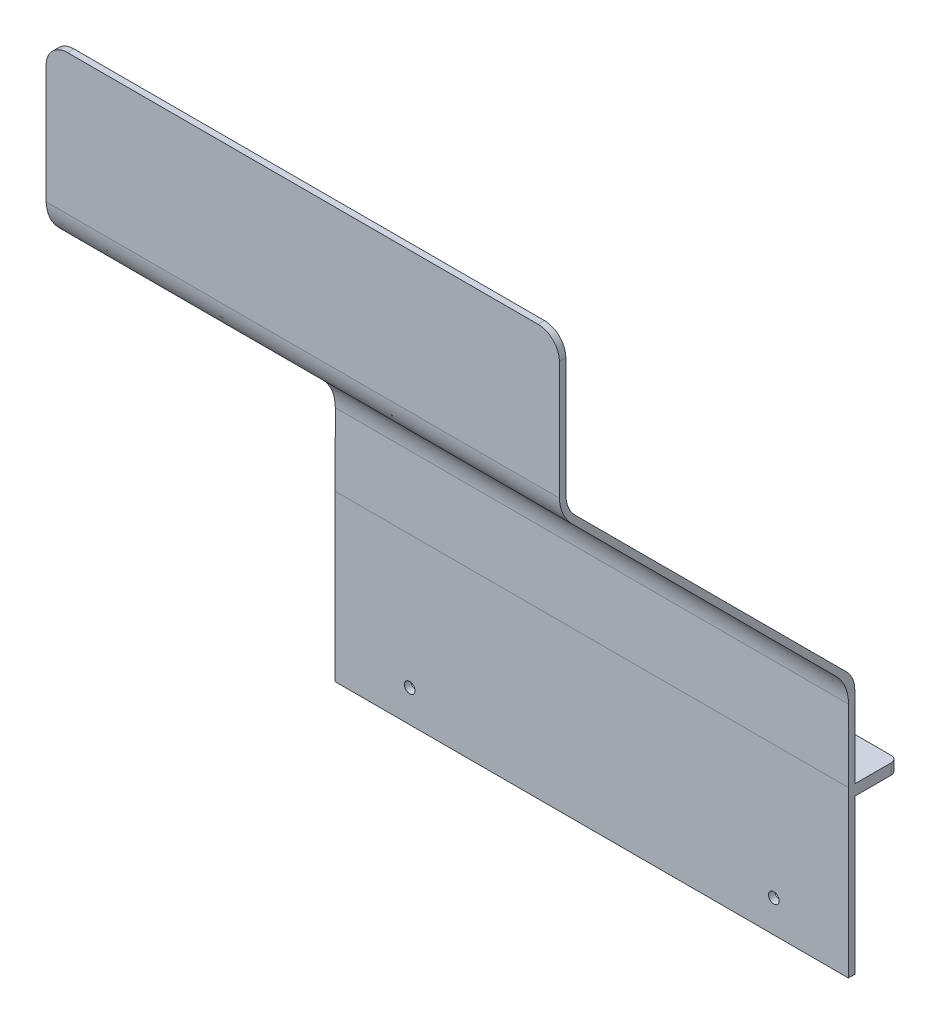
ISO-10303-21;
HEADER;
FILE_DESCRIPTION(('STEP AP214'),'2;1');
FILE_NAME('part.step','',(''),(''),'','','');
FILE_SCHEMA(('AUTOMOTIVE_DESIGN { 1 0 10303 214 1 1 1 1 }'));
ENDSEC;
DATA;
#1=APPLICATION_CONTEXT('core data for automotive mechanical design processes');
#2=APPLICATION_PROTOCOL_DEFINITION('international standard','automotive_design',2000,#1);
#3=PRODUCT_CONTEXT('',#1,'mechanical');
#4=PRODUCT('Part','Part','',(#3));
#5=PRODUCT_RELATED_PRODUCT_CATEGORY('part','',(#4));
#6=PRODUCT_DEFINITION_FORMATION('','',#4);
#7=PRODUCT_DEFINITION_CONTEXT('part definition',#1,'design');
#8=PRODUCT_DEFINITION('design','',#6,#7);
#9=PRODUCT_DEFINITION_SHAPE('','',#8);
#10=(LENGTH_UNIT() NAMED_UNIT(*) SI_UNIT(.MILLI.,.METRE.));
#11=(NAMED_UNIT(*) PLANE_ANGLE_UNIT() SI_UNIT($,.RADIAN.));
#12=(NAMED_UNIT(*) SI_UNIT($,.STERADIAN.) SOLID_ANGLE_UNIT());
#13=UNCERTAINTY_MEASURE_WITH_UNIT(LENGTH_MEASURE(1.E-05),#10,'distance_accuracy_value','');
#14=(GEOMETRIC_REPRESENTATION_CONTEXT(3) GLOBAL_UNCERTAINTY_ASSIGNED_CONTEXT((#13)) GLOBAL_UNIT_ASSIGNED_CONTEXT((#10,
#11,#12)) REPRESENTATION_CONTEXT('',''));
#15=CARTESIAN_POINT('',(0.,0.,0.));
#16=DIRECTION('',(0.,0.,1.));
#17=DIRECTION('',(1.,0.,0.));
#18=AXIS2_PLACEMENT_3D('',#15,#16,#17);
#19=CARTESIAN_POINT('',(0.,41.,0.));
#20=DIRECTION('',(0.,-1.,0.));
#21=DIRECTION('',(1.,0.,0.));
#22=AXIS2_PLACEMENT_3D('',#19,#20,#21);
#23=PLANE('',#22);
#24=CARTESIAN_POINT('',(65.,41.,-8.5));
#25=DIRECTION('',(0.,1.,0.));
#26=DIRECTION('',(1.,0.,0.));
#27=AXIS2_PLACEMENT_3D('',#24,#25,#26);
#28=CIRCLE('',#27,2.50000000000002);
#29=CARTESIAN_POINT('',(67.5,41.,-8.5));
#30=VERTEX_POINT('',#29);
#31=EDGE_CURVE('E361',#30,#30,#28,.T.);
#32=ORIENTED_EDGE('',*,*,#31,.F.);
#33=EDGE_LOOP('',(#32));
#34=FACE_BOUND('',#33,.T.);
#35=CARTESIAN_POINT('',(-65.,41.,-8.5));
#36=DIRECTION('',(0.,1.,0.));
#37=DIRECTION('',(-1.,0.,0.));
#38=AXIS2_PLACEMENT_3D('',#35,#36,#37);
#39=CIRCLE('',#38,2.50000000000002);
#40=CARTESIAN_POINT('',(-67.5,41.,-8.5));
#41=VERTEX_POINT('',#40);
#42=EDGE_CURVE('E421',#41,#41,#39,.T.);
#43=ORIENTED_EDGE('',*,*,#42,.F.);
#44=EDGE_LOOP('',(#43));
#45=FACE_BOUND('',#44,.T.);
#46=DIRECTION('',(-1.,0.,0.));
#47=VECTOR('',#46,1.);
#48=CARTESIAN_POINT('',(119.8,41.,0.));
#49=LINE('',#48,#47);
#50=CARTESIAN_POINT('',(119.8,41.,0.));
#51=VERTEX_POINT('',#50);
#52=CARTESIAN_POINT('',(-119.8,40.9999999999999,0.));
#53=VERTEX_POINT('',#52);
#54=EDGE_CURVE('E444',#51,#53,#49,.T.);
#55=ORIENTED_EDGE('',*,*,#54,.F.);
#56=DIRECTION('',(0.,0.,-1.));
#57=VECTOR('',#56,1.);
#58=CARTESIAN_POINT('',(119.8,41.,3.));
#59=LINE('',#58,#57);
#60=CARTESIAN_POINT('',(119.8,41.,-17.));
#61=VERTEX_POINT('',#60);
#62=EDGE_CURVE('E410',#51,#61,#59,.T.);
#63=ORIENTED_EDGE('',*,*,#62,.T.);
#64=CARTESIAN_POINT('',(116.8,41.,-17.));
#65=DIRECTION('',(0.,-1.,0.));
#66=DIRECTION('',(1.,0.,0.));
#67=AXIS2_PLACEMENT_3D('',#64,#65,#66);
#68=CIRCLE('',#67,3.);
#69=CARTESIAN_POINT('',(116.8,41.,-20.));
#70=VERTEX_POINT('',#69);
#71=EDGE_CURVE('E368',#61,#70,#68,.F.);
#72=ORIENTED_EDGE('',*,*,#71,.T.);
#73=DIRECTION('',(-1.,0.,0.));
#74=VECTOR('',#73,1.);
#75=CARTESIAN_POINT('',(-119.8,40.9999999999999,-20.));
#76=LINE('',#75,#74);
#77=CARTESIAN_POINT('',(-116.8,40.9999999999999,-20.));
#78=VERTEX_POINT('',#77);
#79=EDGE_CURVE('E398',#70,#78,#76,.T.);
#80=ORIENTED_EDGE('',*,*,#79,.T.);
#81=CARTESIAN_POINT('',(-116.8,40.9999999999999,-17.));
#82=DIRECTION('',(0.,-1.,0.));
#83=DIRECTION('',(1.,0.,0.));
#84=AXIS2_PLACEMENT_3D('',#81,#82,#83);
#85=CIRCLE('',#84,3.);
#86=CARTESIAN_POINT('',(-119.8,40.9999999999999,-17.));
#87=VERTEX_POINT('',#86);
#88=EDGE_CURVE('E370',#78,#87,#85,.F.);
#89=ORIENTED_EDGE('',*,*,#88,.T.);
#90=DIRECTION('',(0.,0.,1.));
#91=VECTOR('',#90,1.);
#92=CARTESIAN_POINT('',(-119.8,40.9999999999999,3.));
#93=LINE('',#92,#91);
#94=EDGE_CURVE('E402',#87,#53,#93,.T.);
#95=ORIENTED_EDGE('',*,*,#94,.T.);
#96=EDGE_LOOP('',(#55,#63,#72,#80,#89,#95));
#97=FACE_BOUND('',#96,.T.);
#98=ADVANCED_FACE('F34',(#34,#45,#97),#23,.F.);
#99=CARTESIAN_POINT('',(125.,-36.,3.));
#100=DIRECTION('',(0.,1.,0.));
#101=DIRECTION('',(-1.,0.,0.));
#102=AXIS2_PLACEMENT_3D('',#99,#100,#101);
#103=PLANE('',#102);
#104=DIRECTION('',(1.,0.,0.));
#105=VECTOR('',#104,1.);
#106=CARTESIAN_POINT('',(125.,-36.,3.));
#107=LINE('',#106,#105);
#108=CARTESIAN_POINT('',(-119.8,-36.,3.));
#109=VERTEX_POINT('',#108);
#110=CARTESIAN_POINT('',(119.8,-36.,3.));
#111=VERTEX_POINT('',#110);
#112=EDGE_CURVE('E385',#109,#111,#107,.T.);
#113=ORIENTED_EDGE('',*,*,#112,.F.);
#114=DIRECTION('',(0.,0.,1.));
#115=VECTOR('',#114,1.);
#116=CARTESIAN_POINT('',(-119.8,-36.,-1.99999999999999));
#117=LINE('',#116,#115);
#118=CARTESIAN_POINT('',(-119.8,-36.,0.));
#119=VERTEX_POINT('',#118);
#120=EDGE_CURVE('E437',#119,#109,#117,.T.);
#121=ORIENTED_EDGE('',*,*,#120,.F.);
#122=DIRECTION('',(1.,0.,0.));
#123=VECTOR('',#122,1.);
#124=CARTESIAN_POINT('',(125.,-36.,0.));
#125=LINE('',#124,#123);
#126=CARTESIAN_POINT('',(119.8,-36.,0.));
#127=VERTEX_POINT('',#126);
#128=EDGE_CURVE('E389',#119,#127,#125,.T.);
#129=ORIENTED_EDGE('',*,*,#128,.T.);
#130=DIRECTION('',(0.,0.,1.));
#131=VECTOR('',#130,1.);
#132=CARTESIAN_POINT('',(119.8,-36.,-1.99999999999999));
#133=LINE('',#132,#131);
#134=EDGE_CURVE('E438',#127,#111,#133,.T.);
#135=ORIENTED_EDGE('',*,*,#134,.T.);
#136=EDGE_LOOP('',(#113,#121,#129,#135));
#137=FACE_BOUND('',#136,.T.);
#138=ADVANCED_FACE('F275',(#137),#103,.F.);
#139=CARTESIAN_POINT('',(0.,0.,3.));
#140=DIRECTION('',(0.,0.,1.));
#141=DIRECTION('',(1.,0.,0.));
#142=AXIS2_PLACEMENT_3D('',#139,#140,#141);
#143=PLANE('',#142);
#144=DIRECTION('',(0.,-1.,0.));
#145=VECTOR('',#144,1.);
#146=CARTESIAN_POINT('',(-119.8,40.9999999999999,3.));
#147=LINE('',#146,#145);
#148=CARTESIAN_POINT('',(-119.8,40.9999999999999,3.));
#149=VERTEX_POINT('',#148);
#150=EDGE_CURVE('E392',#149,#109,#147,.T.);
#151=ORIENTED_EDGE('',*,*,#150,.T.);
#152=ORIENTED_EDGE('',*,*,#112,.T.);
#153=DIRECTION('',(0.,-1.,0.));
#154=VECTOR('',#153,1.);
#155=CARTESIAN_POINT('',(119.8,41.,3.));
#156=LINE('',#155,#154);
#157=CARTESIAN_POINT('',(119.8,41.,3.));
#158=VERTEX_POINT('',#157);
#159=EDGE_CURVE('E396',#158,#111,#156,.T.);
#160=ORIENTED_EDGE('',*,*,#159,.F.);
#161=DIRECTION('',(1.,0.,0.));
#162=VECTOR('',#161,1.);
#163=CARTESIAN_POINT('',(-119.8,40.9999999999999,3.));
#164=LINE('',#163,#162);
#165=EDGE_CURVE('E412',#149,#158,#164,.T.);
#166=ORIENTED_EDGE('',*,*,#165,.F.);
#167=EDGE_LOOP('',(#151,#152,#160,#166));
#168=FACE_BOUND('',#167,.T.);
#169=CARTESIAN_POINT('',(-84.9999999999998,-21.,3.));
#170=DIRECTION('',(0.,0.,1.));
#171=DIRECTION('',(1.,0.,0.));
#172=AXIS2_PLACEMENT_3D('',#169,#170,#171);
#173=CIRCLE('',#172,2.50000000000001);
#174=CARTESIAN_POINT('',(-82.4999999999998,-21.,3.));
#175=VERTEX_POINT('',#174);
#176=EDGE_CURVE('E365',#175,#175,#173,.T.);
#177=ORIENTED_EDGE('',*,*,#176,.F.);
#178=EDGE_LOOP('',(#177));
#179=FACE_BOUND('',#178,.T.);
#180=CARTESIAN_POINT('',(84.9999999999998,-21.,3.));
#181=DIRECTION('',(0.,0.,1.));
#182=DIRECTION('',(-1.,0.,0.));
#183=AXIS2_PLACEMENT_3D('',#180,#181,#182);
#184=CIRCLE('',#183,2.50000000000001);
#185=CARTESIAN_POINT('',(82.4999999999998,-21.,3.));
#186=VERTEX_POINT('',#185);
#187=EDGE_CURVE('E426',#186,#186,#184,.T.);
#188=ORIENTED_EDGE('',*,*,#187,.F.);
#189=EDGE_LOOP('',(#188));
#190=FACE_BOUND('',#189,.T.);
#191=ADVANCED_FACE('F290',(#168,#179,#190),#143,.T.);
#192=CARTESIAN_POINT('',(0.,0.,0.));
#193=DIRECTION('',(0.,0.,1.));
#194=DIRECTION('',(1.,0.,0.));
#195=AXIS2_PLACEMENT_3D('',#192,#193,#194);
#196=PLANE('',#195);
#197=CARTESIAN_POINT('',(-84.9999999999998,-21.,0.));
#198=DIRECTION('',(0.,0.,1.));
#199=DIRECTION('',(1.,0.,0.));
#200=AXIS2_PLACEMENT_3D('',#197,#198,#199);
#201=CIRCLE('',#200,2.50000000000001);
#202=CARTESIAN_POINT('',(-82.4999999999998,-21.,0.));
#203=VERTEX_POINT('',#202);
#204=EDGE_CURVE('E358',#203,#203,#201,.T.);
#205=ORIENTED_EDGE('',*,*,#204,.T.);
#206=EDGE_LOOP('',(#205));
#207=FACE_BOUND('',#206,.T.);
#208=CARTESIAN_POINT('',(84.9999999999998,-21.,0.));
#209=DIRECTION('',(0.,0.,1.));
#210=DIRECTION('',(1.,0.,0.));
#211=AXIS2_PLACEMENT_3D('',#208,#209,#210);
#212=CIRCLE('',#211,2.50000000000001);
#213=CARTESIAN_POINT('',(87.4999999999998,-21.,0.));
#214=VERTEX_POINT('',#213);
#215=EDGE_CURVE('E362',#214,#214,#212,.T.);
#216=ORIENTED_EDGE('',*,*,#215,.T.);
#217=EDGE_LOOP('',(#216));
#218=FACE_BOUND('',#217,.T.);
#219=ORIENTED_EDGE('',*,*,#128,.F.);
#220=DIRECTION('',(0.,1.,0.));
#221=VECTOR('',#220,1.);
#222=CARTESIAN_POINT('',(-119.8,0.,0.));
#223=LINE('',#222,#221);
#224=CARTESIAN_POINT('',(-119.8,36.,0.));
#225=VERTEX_POINT('',#224);
#226=EDGE_CURVE('E429',#119,#225,#223,.T.);
#227=ORIENTED_EDGE('',*,*,#226,.T.);
#228=DIRECTION('',(-1.,0.,0.));
#229=VECTOR('',#228,1.);
#230=CARTESIAN_POINT('',(125.,36.,0.));
#231=LINE('',#230,#229);
#232=CARTESIAN_POINT('',(119.8,36.,0.));
#233=VERTEX_POINT('',#232);
#234=EDGE_CURVE('E386',#233,#225,#231,.T.);
#235=ORIENTED_EDGE('',*,*,#234,.F.);
#236=DIRECTION('',(0.,-1.,0.));
#237=VECTOR('',#236,1.);
#238=CARTESIAN_POINT('',(119.8,0.,0.));
#239=LINE('',#238,#237);
#240=EDGE_CURVE('E434',#233,#127,#239,.T.);
#241=ORIENTED_EDGE('',*,*,#240,.T.);
#242=EDGE_LOOP('',(#219,#227,#235,#241));
#243=FACE_BOUND('',#242,.T.);
#244=ADVANCED_FACE('F289',(#207,#218,#243),#196,.F.);
#245=CARTESIAN_POINT('',(-119.8,40.9999999999999,3.));
#246=DIRECTION('',(1.,0.,0.));
#247=DIRECTION('',(0.,1.,0.));
#248=AXIS2_PLACEMENT_3D('',#245,#246,#247);
#249=PLANE('',#248);
#250=DIRECTION('',(0.,1.,0.));
#251=VECTOR('',#250,1.);
#252=CARTESIAN_POINT('',(-119.8,0.,137.916490723047));
#253=LINE('',#252,#251);
#254=CARTESIAN_POINT('',(-119.8,225.455844122715,137.916490723047));
#255=VERTEX_POINT('',#254);
#256=CARTESIAN_POINT('',(-119.8,280.774355099311,137.916490723047));
#257=VERTEX_POINT('',#256);
#258=EDGE_CURVE('E460',#255,#257,#253,.T.);
#259=ORIENTED_EDGE('',*,*,#258,.T.);
#260=DIRECTION('',(0.,0.,1.));
#261=VECTOR('',#260,1.);
#262=CARTESIAN_POINT('',(-119.8,280.774355099311,3.));
#263=LINE('',#262,#261);
#264=CARTESIAN_POINT('',(-119.8,280.774355099311,134.916490723047));
#265=VERTEX_POINT('',#264);
#266=EDGE_CURVE('E11',#257,#265,#263,.F.);
#267=ORIENTED_EDGE('',*,*,#266,.T.);
#268=DIRECTION('',(0.,-1.,0.));
#269=VECTOR('',#268,1.);
#270=CARTESIAN_POINT('',(-119.8,0.,134.916490723047));
#271=LINE('',#270,#269);
#272=CARTESIAN_POINT('',(-119.8,225.455844122715,134.916490723047));
#273=VERTEX_POINT('',#272);
#274=EDGE_CURVE('E210',#265,#273,#271,.T.);
#275=ORIENTED_EDGE('',*,*,#274,.T.);
#276=CARTESIAN_POINT('',(-119.8,225.455844122715,119.916490723047));
#277=DIRECTION('',(-1.,0.,0.));
#278=DIRECTION('',(0.,-1.,0.));
#279=AXIS2_PLACEMENT_3D('',#276,#277,#278);
#280=CIRCLE('',#279,15.);
#281=CARTESIAN_POINT('',(-119.8,214.849242404917,130.523092440845));
#282=VERTEX_POINT('',#281);
#283=EDGE_CURVE('E207',#282,#273,#280,.T.);
#284=ORIENTED_EDGE('',*,*,#283,.F.);
#285=DIRECTION('',(0.,-0.707106781186552,-0.707106781186543));
#286=VECTOR('',#285,1.);
#287=CARTESIAN_POINT('',(-119.8,42.1630749820351,-42.1630749820357));
#288=LINE('',#287,#286);
#289=CARTESIAN_POINT('',(-119.8,88.1297700251942,3.80362006112284));
#290=VERTEX_POINT('',#289);
#291=EDGE_CURVE('E338',#282,#290,#288,.T.);
#292=ORIENTED_EDGE('',*,*,#291,.T.);
#293=CARTESIAN_POINT('',(-119.8,78.9470188875171,12.9863711988001));
#294=DIRECTION('',(-1.,0.,0.));
#295=DIRECTION('',(0.,-1.,0.));
#296=AXIS2_PLACEMENT_3D('',#293,#294,#295);
#297=CIRCLE('',#296,12.9863711988001);
#298=CARTESIAN_POINT('',(-119.8,78.947018887517,0.));
#299=VERTEX_POINT('',#298);
#300=EDGE_CURVE('E197',#299,#290,#297,.F.);
#301=ORIENTED_EDGE('',*,*,#300,.F.);
#302=DIRECTION('',(0.,-1.,0.));
#303=VECTOR('',#302,1.);
#304=CARTESIAN_POINT('',(-119.8,0.,0.));
#305=LINE('',#304,#303);
#306=EDGE_CURVE('E484',#299,#53,#305,.T.);
#307=ORIENTED_EDGE('',*,*,#306,.T.);
#308=ORIENTED_EDGE('',*,*,#94,.F.);
#309=DIRECTION('',(0.,-1.,0.));
#310=VECTOR('',#309,1.);
#311=CARTESIAN_POINT('',(-119.8,40.9999999999999,-17.));
#312=LINE('',#311,#310);
#313=CARTESIAN_POINT('',(-119.8,36.,-17.));
#314=VERTEX_POINT('',#313);
#315=EDGE_CURVE('E357',#87,#314,#312,.T.);
#316=ORIENTED_EDGE('',*,*,#315,.T.);
#317=DIRECTION('',(0.,0.,1.));
#318=VECTOR('',#317,1.);
#319=CARTESIAN_POINT('',(-119.8,36.,3.));
#320=LINE('',#319,#318);
#321=EDGE_CURVE('E405',#314,#225,#320,.T.);
#322=ORIENTED_EDGE('',*,*,#321,.T.);
#323=ORIENTED_EDGE('',*,*,#226,.F.);
#324=ORIENTED_EDGE('',*,*,#120,.T.);
#325=ORIENTED_EDGE('',*,*,#150,.F.);
#326=DIRECTION('',(0.,0.999996932586317,-0.00247685646685071));
#327=VECTOR('',#326,1.);
#328=CARTESIAN_POINT('',(-119.8,0.00768207414414502,3.10153239918773));
#329=LINE('',#328,#327);
#330=CARTESIAN_POINT('',(-119.8,74.7157287525383,2.91649072304719));
#331=VERTEX_POINT('',#330);
#332=EDGE_CURVE('E478',#149,#331,#329,.T.);
#333=ORIENTED_EDGE('',*,*,#332,.T.);
#334=CARTESIAN_POINT('',(-119.8,74.7157287525383,2.91649072304719));
#335=CARTESIAN_POINT('',(-119.8,82.9519982352765,3.03237723446116));
#336=CARTESIAN_POINT('',(-119.8,88.8578643762694,8.77435509931623));
#337=B_SPLINE_CURVE_WITH_KNOTS('',2,(#334,#335,#336),.UNSPECIFIED.,.F.,.F.,(3,3),(0.,1.),.UNSPECIFIED.);
#338=CARTESIAN_POINT('',(-119.8,88.8578643762694,8.77435509931623));
#339=VERTEX_POINT('',#338);
#340=EDGE_CURVE('E473',#331,#339,#337,.T.);
#341=ORIENTED_EDGE('',*,*,#340,.T.);
#342=DIRECTION('',(0.,0.707106781186547,0.707106781186548));
#343=VECTOR('',#342,1.);
#344=CARTESIAN_POINT('',(-119.8,40.0417546384766,-40.0417546384766));
#345=LINE('',#344,#343);
#346=CARTESIAN_POINT('',(-119.8,212.142135623731,132.058626346778));
#347=VERTEX_POINT('',#346);
#348=EDGE_CURVE('E467',#339,#347,#345,.T.);
#349=ORIENTED_EDGE('',*,*,#348,.T.);
#350=CARTESIAN_POINT('',(-119.8,212.142135623731,132.058626346778));
#351=CARTESIAN_POINT('',(-119.8,217.729604737047,137.487179547832));
#352=CARTESIAN_POINT('',(-119.8,225.455844122715,137.916490723047));
#353=B_SPLINE_CURVE_WITH_KNOTS('',2,(#350,#351,#352),.UNSPECIFIED.,.F.,.F.,(3,3),(0.,1.),.UNSPECIFIED.);
#354=EDGE_CURVE('E462',#347,#255,#353,.T.);
#355=ORIENTED_EDGE('',*,*,#354,.T.);
#356=EDGE_LOOP('',(#259,#267,#275,#284,#292,#301,#307,#308,#316,#322,#323,#324,#325,#333,#341,
#349,#355));
#357=FACE_BOUND('',#356,.T.);
#358=ADVANCED_FACE('F286',(#357),#249,.F.);
#359=CARTESIAN_POINT('',(119.8,41.,3.));
#360=DIRECTION('',(-1.,0.,0.));
#361=DIRECTION('',(0.,-1.,0.));
#362=AXIS2_PLACEMENT_3D('',#359,#360,#361);
#363=PLANE('',#362);
#364=DIRECTION('',(0.,-1.,0.));
#365=VECTOR('',#364,1.);
#366=CARTESIAN_POINT('',(119.8,0.,134.916490723047));
#367=LINE('',#366,#365);
#368=CARTESIAN_POINT('',(119.8,280.774355099311,134.916490723047));
#369=VERTEX_POINT('',#368);
#370=CARTESIAN_POINT('',(119.8,225.455844122715,134.916490723047));
#371=VERTEX_POINT('',#370);
#372=EDGE_CURVE('E489',#369,#371,#367,.T.);
#373=ORIENTED_EDGE('',*,*,#372,.F.);
#374=DIRECTION('',(0.,0.,1.));
#375=VECTOR('',#374,1.);
#376=CARTESIAN_POINT('',(119.8,280.774355099311,3.));
#377=LINE('',#376,#375);
#378=CARTESIAN_POINT('',(119.8,280.774355099311,137.916490723047));
#379=VERTEX_POINT('',#378);
#380=EDGE_CURVE('E318',#369,#379,#377,.T.);
#381=ORIENTED_EDGE('',*,*,#380,.T.);
#382=DIRECTION('',(0.,1.,0.));
#383=VECTOR('',#382,1.);
#384=CARTESIAN_POINT('',(119.8,0.,137.916490723047));
#385=LINE('',#384,#383);
#386=CARTESIAN_POINT('',(119.8,225.455844122715,137.916490723047));
#387=VERTEX_POINT('',#386);
#388=EDGE_CURVE('E351',#387,#379,#385,.T.);
#389=ORIENTED_EDGE('',*,*,#388,.F.);
#390=CARTESIAN_POINT('',(119.8,212.142135623731,132.058626346778));
#391=CARTESIAN_POINT('',(119.8,217.729604737047,137.487179547832));
#392=CARTESIAN_POINT('',(119.8,225.455844122715,137.916490723047));
#393=B_SPLINE_CURVE_WITH_KNOTS('',2,(#390,#391,#392),.UNSPECIFIED.,.F.,.F.,(3,3),(0.,1.),.UNSPECIFIED.);
#394=CARTESIAN_POINT('',(119.8,212.142135623731,132.058626346778));
#395=VERTEX_POINT('',#394);
#396=EDGE_CURVE('E491',#395,#387,#393,.T.);
#397=ORIENTED_EDGE('',*,*,#396,.F.);
#398=DIRECTION('',(0.,0.707106781186547,0.707106781186548));
#399=VECTOR('',#398,1.);
#400=CARTESIAN_POINT('',(119.8,40.0417546384767,-40.0417546384766));
#401=LINE('',#400,#399);
#402=CARTESIAN_POINT('',(119.8,88.8578643762694,8.77435509931623));
#403=VERTEX_POINT('',#402);
#404=EDGE_CURVE('E226',#403,#395,#401,.T.);
#405=ORIENTED_EDGE('',*,*,#404,.F.);
#406=CARTESIAN_POINT('',(119.8,74.7157287525383,2.91649072304719));
#407=CARTESIAN_POINT('',(119.8,82.9519982352765,3.03237723446116));
#408=CARTESIAN_POINT('',(119.8,88.8578643762694,8.77435509931623));
#409=B_SPLINE_CURVE_WITH_KNOTS('',2,(#406,#407,#408),.UNSPECIFIED.,.F.,.F.,(3,3),(0.,1.),.UNSPECIFIED.);
#410=CARTESIAN_POINT('',(119.8,74.7157287525383,2.91649072304719));
#411=VERTEX_POINT('',#410);
#412=EDGE_CURVE('E220',#411,#403,#409,.T.);
#413=ORIENTED_EDGE('',*,*,#412,.F.);
#414=DIRECTION('',(0.,0.999996932586317,-0.00247685646685071));
#415=VECTOR('',#414,1.);
#416=CARTESIAN_POINT('',(119.8,0.00768207414419822,3.10153239918773));
#417=LINE('',#416,#415);
#418=EDGE_CURVE('E217',#158,#411,#417,.T.);
#419=ORIENTED_EDGE('',*,*,#418,.F.);
#420=ORIENTED_EDGE('',*,*,#159,.T.);
#421=ORIENTED_EDGE('',*,*,#134,.F.);
#422=ORIENTED_EDGE('',*,*,#240,.F.);
#423=DIRECTION('',(0.,0.,-1.));
#424=VECTOR('',#423,1.);
#425=CARTESIAN_POINT('',(119.8,36.,3.));
#426=LINE('',#425,#424);
#427=CARTESIAN_POINT('',(119.8,36.,-17.));
#428=VERTEX_POINT('',#427);
#429=EDGE_CURVE('E403',#233,#428,#426,.T.);
#430=ORIENTED_EDGE('',*,*,#429,.T.);
#431=DIRECTION('',(0.,-1.,0.));
#432=VECTOR('',#431,1.);
#433=CARTESIAN_POINT('',(119.8,41.,-17.));
#434=LINE('',#433,#432);
#435=EDGE_CURVE('E372',#428,#61,#434,.F.);
#436=ORIENTED_EDGE('',*,*,#435,.T.);
#437=ORIENTED_EDGE('',*,*,#62,.F.);
#438=DIRECTION('',(0.,-1.,0.));
#439=VECTOR('',#438,1.);
#440=CARTESIAN_POINT('',(119.8,0.,0.));
#441=LINE('',#440,#439);
#442=CARTESIAN_POINT('',(119.8,78.9470188875171,0.));
#443=VERTEX_POINT('',#442);
#444=EDGE_CURVE('E190',#443,#51,#441,.T.);
#445=ORIENTED_EDGE('',*,*,#444,.F.);
#446=CARTESIAN_POINT('',(119.8,78.9470188875171,12.9863711988001));
#447=DIRECTION('',(-1.,0.,0.));
#448=DIRECTION('',(0.,-1.,0.));
#449=AXIS2_PLACEMENT_3D('',#446,#447,#448);
#450=CIRCLE('',#449,12.9863711988001);
#451=CARTESIAN_POINT('',(119.8,88.1297700251943,3.80362006112284));
#452=VERTEX_POINT('',#451);
#453=EDGE_CURVE('E181',#443,#452,#450,.F.);
#454=ORIENTED_EDGE('',*,*,#453,.T.);
#455=DIRECTION('',(0.,-0.707106781186552,-0.707106781186543));
#456=VECTOR('',#455,1.);
#457=CARTESIAN_POINT('',(119.8,42.1630749820351,-42.1630749820357));
#458=LINE('',#457,#456);
#459=CARTESIAN_POINT('',(119.8,214.849242404917,130.523092440845));
#460=VERTEX_POINT('',#459);
#461=EDGE_CURVE('E187',#460,#452,#458,.T.);
#462=ORIENTED_EDGE('',*,*,#461,.F.);
#463=CARTESIAN_POINT('',(119.8,225.455844122715,119.916490723047));
#464=DIRECTION('',(-1.,0.,0.));
#465=DIRECTION('',(0.,-1.,0.));
#466=AXIS2_PLACEMENT_3D('',#463,#464,#465);
#467=CIRCLE('',#466,15.);
#468=EDGE_CURVE('E202',#460,#371,#467,.T.);
#469=ORIENTED_EDGE('',*,*,#468,.T.);
#470=EDGE_LOOP('',(#373,#381,#389,#397,#405,#413,#419,#420,#421,#422,#430,#436,#437,#445,#454,
#462,#469));
#471=FACE_BOUND('',#470,.T.);
#472=ADVANCED_FACE('F184',(#471),#363,.F.);
#473=CARTESIAN_POINT('',(-119.8,40.9999999999999,-20.));
#474=DIRECTION('',(0.,0.,1.));
#475=DIRECTION('',(1.,0.,0.));
#476=AXIS2_PLACEMENT_3D('',#473,#474,#475);
#477=PLANE('',#476);
#478=ORIENTED_EDGE('',*,*,#79,.F.);
#479=DIRECTION('',(0.,-1.,0.));
#480=VECTOR('',#479,1.);
#481=CARTESIAN_POINT('',(116.8,41.,-20.));
#482=LINE('',#481,#480);
#483=CARTESIAN_POINT('',(116.8,36.,-20.));
#484=VERTEX_POINT('',#483);
#485=EDGE_CURVE('E380',#70,#484,#482,.T.);
#486=ORIENTED_EDGE('',*,*,#485,.T.);
#487=DIRECTION('',(-1.,0.,0.));
#488=VECTOR('',#487,1.);
#489=CARTESIAN_POINT('',(-119.8,36.,-20.));
#490=LINE('',#489,#488);
#491=CARTESIAN_POINT('',(-116.8,36.,-20.));
#492=VERTEX_POINT('',#491);
#493=EDGE_CURVE('E399',#484,#492,#490,.T.);
#494=ORIENTED_EDGE('',*,*,#493,.T.);
#495=DIRECTION('',(0.,-1.,0.));
#496=VECTOR('',#495,1.);
#497=CARTESIAN_POINT('',(-116.8,40.9999999999999,-20.));
#498=LINE('',#497,#496);
#499=EDGE_CURVE('E383',#492,#78,#498,.F.);
#500=ORIENTED_EDGE('',*,*,#499,.T.);
#501=EDGE_LOOP('',(#478,#486,#494,#500));
#502=FACE_BOUND('',#501,.T.);
#503=ADVANCED_FACE('F279',(#502),#477,.F.);
#504=CARTESIAN_POINT('',(0.,36.,0.));
#505=DIRECTION('',(0.,-1.,0.));
#506=DIRECTION('',(1.,0.,0.));
#507=AXIS2_PLACEMENT_3D('',#504,#505,#506);
#508=PLANE('',#507);
#509=CARTESIAN_POINT('',(-65.,36.,-8.5));
#510=DIRECTION('',(0.,1.,0.));
#511=DIRECTION('',(-1.,0.,0.));
#512=AXIS2_PLACEMENT_3D('',#509,#510,#511);
#513=CIRCLE('',#512,2.50000000000002);
#514=CARTESIAN_POINT('',(-67.5,36.,-8.5));
#515=VERTEX_POINT('',#514);
#516=EDGE_CURVE('E407',#515,#515,#513,.T.);
#517=ORIENTED_EDGE('',*,*,#516,.T.);
#518=EDGE_LOOP('',(#517));
#519=FACE_BOUND('',#518,.T.);
#520=CARTESIAN_POINT('',(65.,36.,-8.5));
#521=DIRECTION('',(0.,1.,0.));
#522=DIRECTION('',(1.,0.,0.));
#523=AXIS2_PLACEMENT_3D('',#520,#521,#522);
#524=CIRCLE('',#523,2.50000000000002);
#525=CARTESIAN_POINT('',(67.5,36.,-8.5));
#526=VERTEX_POINT('',#525);
#527=EDGE_CURVE('E418',#526,#526,#524,.T.);
#528=ORIENTED_EDGE('',*,*,#527,.T.);
#529=EDGE_LOOP('',(#528));
#530=FACE_BOUND('',#529,.T.);
#531=ORIENTED_EDGE('',*,*,#493,.F.);
#532=CARTESIAN_POINT('',(116.8,36.,-17.));
#533=DIRECTION('',(0.,-1.,0.));
#534=DIRECTION('',(1.,0.,0.));
#535=AXIS2_PLACEMENT_3D('',#532,#533,#534);
#536=CIRCLE('',#535,3.);
#537=EDGE_CURVE('E375',#484,#428,#536,.T.);
#538=ORIENTED_EDGE('',*,*,#537,.T.);
#539=ORIENTED_EDGE('',*,*,#429,.F.);
#540=ORIENTED_EDGE('',*,*,#234,.T.);
#541=ORIENTED_EDGE('',*,*,#321,.F.);
#542=CARTESIAN_POINT('',(-116.8,36.,-17.));
#543=DIRECTION('',(0.,-1.,0.));
#544=DIRECTION('',(1.,0.,0.));
#545=AXIS2_PLACEMENT_3D('',#542,#543,#544);
#546=CIRCLE('',#545,3.);
#547=EDGE_CURVE('E378',#314,#492,#546,.T.);
#548=ORIENTED_EDGE('',*,*,#547,.T.);
#549=EDGE_LOOP('',(#531,#538,#539,#540,#541,#548));
#550=FACE_BOUND('',#549,.T.);
#551=ADVANCED_FACE('F271',(#519,#530,#550),#508,.T.);
#552=CARTESIAN_POINT('',(65.,36.,-8.5));
#553=DIRECTION('',(0.,1.,0.));
#554=DIRECTION('',(-1.,0.,0.));
#555=AXIS2_PLACEMENT_3D('',#552,#553,#554);
#556=CYLINDRICAL_SURFACE('',#555,2.50000000000002);
#557=ORIENTED_EDGE('',*,*,#527,.F.);
#558=EDGE_LOOP('',(#557));
#559=FACE_BOUND('',#558,.T.);
#560=ORIENTED_EDGE('',*,*,#31,.T.);
#561=EDGE_LOOP('',(#560));
#562=FACE_BOUND('',#561,.T.);
#563=ADVANCED_FACE('F267',(#559,#562),#556,.F.);
#564=CARTESIAN_POINT('',(-65.,36.,-8.5));
#565=DIRECTION('',(0.,1.,0.));
#566=DIRECTION('',(-1.,0.,0.));
#567=AXIS2_PLACEMENT_3D('',#564,#565,#566);
#568=CYLINDRICAL_SURFACE('',#567,2.50000000000002);
#569=ORIENTED_EDGE('',*,*,#516,.F.);
#570=EDGE_LOOP('',(#569));
#571=FACE_BOUND('',#570,.T.);
#572=ORIENTED_EDGE('',*,*,#42,.T.);
#573=EDGE_LOOP('',(#572));
#574=FACE_BOUND('',#573,.T.);
#575=ADVANCED_FACE('F263',(#571,#574),#568,.F.);
#576=CARTESIAN_POINT('',(116.8,41.,-17.));
#577=DIRECTION('',(0.,-1.,0.));
#578=DIRECTION('',(1.,0.,0.));
#579=AXIS2_PLACEMENT_3D('',#576,#577,#578);
#580=CYLINDRICAL_SURFACE('',#579,3.);
#581=ORIENTED_EDGE('',*,*,#71,.F.);
#582=ORIENTED_EDGE('',*,*,#435,.F.);
#583=ORIENTED_EDGE('',*,*,#537,.F.);
#584=ORIENTED_EDGE('',*,*,#485,.F.);
#585=EDGE_LOOP('',(#581,#582,#583,#584));
#586=FACE_BOUND('',#585,.T.);
#587=ADVANCED_FACE('F266',(#586),#580,.T.);
#588=CARTESIAN_POINT('',(-116.8,40.9999999999999,-17.));
#589=DIRECTION('',(0.,-1.,0.));
#590=DIRECTION('',(1.,0.,0.));
#591=AXIS2_PLACEMENT_3D('',#588,#589,#590);
#592=CYLINDRICAL_SURFACE('',#591,3.);
#593=ORIENTED_EDGE('',*,*,#88,.F.);
#594=ORIENTED_EDGE('',*,*,#499,.F.);
#595=ORIENTED_EDGE('',*,*,#547,.F.);
#596=ORIENTED_EDGE('',*,*,#315,.F.);
#597=EDGE_LOOP('',(#593,#594,#595,#596));
#598=FACE_BOUND('',#597,.T.);
#599=ADVANCED_FACE('F261',(#598),#592,.T.);
#600=CARTESIAN_POINT('',(84.9999999999998,-21.,-2.));
#601=DIRECTION('',(0.,0.,1.));
#602=DIRECTION('',(1.,0.,0.));
#603=AXIS2_PLACEMENT_3D('',#600,#601,#602);
#604=CYLINDRICAL_SURFACE('',#603,2.50000000000001);
#605=ORIENTED_EDGE('',*,*,#187,.T.);
#606=EDGE_LOOP('',(#605));
#607=FACE_BOUND('',#606,.T.);
#608=ORIENTED_EDGE('',*,*,#215,.F.);
#609=EDGE_LOOP('',(#608));
#610=FACE_BOUND('',#609,.T.);
#611=ADVANCED_FACE('F257',(#607,#610),#604,.F.);
#612=CARTESIAN_POINT('',(-84.9999999999998,-21.,-2.));
#613=DIRECTION('',(0.,0.,1.));
#614=DIRECTION('',(1.,0.,0.));
#615=AXIS2_PLACEMENT_3D('',#612,#613,#614);
#616=CYLINDRICAL_SURFACE('',#615,2.50000000000001);
#617=ORIENTED_EDGE('',*,*,#176,.T.);
#618=EDGE_LOOP('',(#617));
#619=FACE_BOUND('',#618,.T.);
#620=ORIENTED_EDGE('',*,*,#204,.F.);
#621=EDGE_LOOP('',(#620));
#622=FACE_BOUND('',#621,.T.);
#623=ADVANCED_FACE('F253',(#619,#622),#616,.F.);
#624=CARTESIAN_POINT('',(119.8,42.1630749820351,-42.1630749820357));
#625=DIRECTION('',(0.,0.707106781186543,-0.707106781186552));
#626=DIRECTION('',(0.,0.707106781186552,0.707106781186543));
#627=AXIS2_PLACEMENT_3D('',#624,#625,#626);
#628=PLANE('',#627);
#629=CARTESIAN_POINT('',(107.500000000015,161.230447378301,76.9042974142288));
#630=DIRECTION('',(0.,0.707106781186543,-0.707106781186552));
#631=DIRECTION('',(0.,0.707106781186552,0.707106781186543));
#632=AXIS2_PLACEMENT_3D('',#629,#630,#631);
#633=CIRCLE('',#632,1.79999999999999);
#634=CARTESIAN_POINT('',(107.500000000015,162.503239584437,78.1770896203645));
#635=VERTEX_POINT('',#634);
#636=EDGE_CURVE('E326',#635,#635,#633,.T.);
#637=ORIENTED_EDGE('',*,*,#636,.F.);
#638=EDGE_LOOP('',(#637));
#639=FACE_BOUND('',#638,.T.);
#640=CARTESIAN_POINT('',(-107.499999999991,161.2304473783,76.9042974142277));
#641=DIRECTION('',(0.,0.707106781186543,-0.707106781186552));
#642=DIRECTION('',(0.,0.707106781186552,0.707106781186543));
#643=AXIS2_PLACEMENT_3D('',#640,#641,#642);
#644=CIRCLE('',#643,1.79999999999999);
#645=CARTESIAN_POINT('',(-107.499999999991,162.503239584436,78.1770896203635));
#646=VERTEX_POINT('',#645);
#647=EDGE_CURVE('E331',#646,#646,#644,.T.);
#648=ORIENTED_EDGE('',*,*,#647,.F.);
#649=EDGE_LOOP('',(#648));
#650=FACE_BOUND('',#649,.T.);
#651=ORIENTED_EDGE('',*,*,#291,.F.);
#652=DIRECTION('',(-1.,0.,0.));
#653=VECTOR('',#652,1.);
#654=CARTESIAN_POINT('',(119.8,214.849242404917,130.523092440845));
#655=LINE('',#654,#653);
#656=EDGE_CURVE('E205',#460,#282,#655,.T.);
#657=ORIENTED_EDGE('',*,*,#656,.F.);
#658=ORIENTED_EDGE('',*,*,#461,.T.);
#659=DIRECTION('',(-1.,0.,0.));
#660=VECTOR('',#659,1.);
#661=CARTESIAN_POINT('',(119.8,88.1297700251943,3.80362006112284));
#662=LINE('',#661,#660);
#663=EDGE_CURVE('E194',#452,#290,#662,.T.);
#664=ORIENTED_EDGE('',*,*,#663,.T.);
#665=EDGE_LOOP('',(#651,#657,#658,#664));
#666=FACE_BOUND('',#665,.T.);
#667=ADVANCED_FACE('F204',(#639,#650,#666),#628,.T.);
#668=CARTESIAN_POINT('',(119.8,225.455844122715,119.916490723047));
#669=DIRECTION('',(-1.,0.,0.));
#670=DIRECTION('',(0.,-1.,0.));
#671=AXIS2_PLACEMENT_3D('',#668,#669,#670);
#672=CYLINDRICAL_SURFACE('',#671,15.);
#673=ORIENTED_EDGE('',*,*,#283,.T.);
#674=DIRECTION('',(-1.,0.,0.));
#675=VECTOR('',#674,1.);
#676=CARTESIAN_POINT('',(119.8,225.455844122715,134.916490723047));
#677=LINE('',#676,#675);
#678=EDGE_CURVE('E455',#371,#273,#677,.T.);
#679=ORIENTED_EDGE('',*,*,#678,.F.);
#680=ORIENTED_EDGE('',*,*,#468,.F.);
#681=ORIENTED_EDGE('',*,*,#656,.T.);
#682=EDGE_LOOP('',(#673,#679,#680,#681));
#683=FACE_BOUND('',#682,.T.);
#684=ADVANCED_FACE('F252',(#683),#672,.F.);
#685=CARTESIAN_POINT('',(119.8,0.,134.916490723047));
#686=DIRECTION('',(0.,0.,-1.));
#687=DIRECTION('',(-1.,0.,0.));
#688=AXIS2_PLACEMENT_3D('',#685,#686,#687);
#689=PLANE('',#688);
#690=DIRECTION('',(1.,0.,0.));
#691=VECTOR('',#690,1.);
#692=CARTESIAN_POINT('',(0.,290.774355099311,134.916490723047));
#693=LINE('',#692,#691);
#694=CARTESIAN_POINT('',(-109.8,290.774355099311,134.916490723047));
#695=VERTEX_POINT('',#694);
#696=CARTESIAN_POINT('',(109.8,290.774355099311,134.916490723047));
#697=VERTEX_POINT('',#696);
#698=EDGE_CURVE('E337',#695,#697,#693,.T.);
#699=ORIENTED_EDGE('',*,*,#698,.T.);
#700=CARTESIAN_POINT('',(109.8,280.774355099311,134.916490723047));
#701=DIRECTION('',(0.,0.,-1.));
#702=DIRECTION('',(-1.,0.,0.));
#703=AXIS2_PLACEMENT_3D('',#700,#701,#702);
#704=CIRCLE('',#703,10.);
#705=EDGE_CURVE('E43',#697,#369,#704,.T.);
#706=ORIENTED_EDGE('',*,*,#705,.T.);
#707=ORIENTED_EDGE('',*,*,#372,.T.);
#708=ORIENTED_EDGE('',*,*,#678,.T.);
#709=ORIENTED_EDGE('',*,*,#274,.F.);
#710=CARTESIAN_POINT('',(-109.8,280.774355099311,134.916490723047));
#711=DIRECTION('',(0.,0.,-1.));
#712=DIRECTION('',(-1.,0.,0.));
#713=AXIS2_PLACEMENT_3D('',#710,#711,#712);
#714=CIRCLE('',#713,10.);
#715=EDGE_CURVE('E320',#265,#695,#714,.T.);
#716=ORIENTED_EDGE('',*,*,#715,.T.);
#717=EDGE_LOOP('',(#699,#706,#707,#708,#709,#716));
#718=FACE_BOUND('',#717,.T.);
#719=ADVANCED_FACE('F505',(#718),#689,.T.);
#720=CARTESIAN_POINT('',(119.8,0.,137.916490723047));
#721=DIRECTION('',(0.,0.,1.));
#722=DIRECTION('',(1.,0.,0.));
#723=AXIS2_PLACEMENT_3D('',#720,#721,#722);
#724=PLANE('',#723);
#725=ORIENTED_EDGE('',*,*,#388,.T.);
#726=CARTESIAN_POINT('',(109.8,280.774355099311,137.916490723047));
#727=DIRECTION('',(0.,0.,1.));
#728=DIRECTION('',(1.,0.,0.));
#729=AXIS2_PLACEMENT_3D('',#726,#727,#728);
#730=CIRCLE('',#729,10.);
#731=CARTESIAN_POINT('',(109.8,290.774355099311,137.916490723047));
#732=VERTEX_POINT('',#731);
#733=EDGE_CURVE('E349',#379,#732,#730,.T.);
#734=ORIENTED_EDGE('',*,*,#733,.T.);
#735=DIRECTION('',(1.,0.,0.));
#736=VECTOR('',#735,1.);
#737=CARTESIAN_POINT('',(0.,290.774355099311,137.916490723047));
#738=LINE('',#737,#736);
#739=CARTESIAN_POINT('',(-109.8,290.774355099311,137.916490723047));
#740=VERTEX_POINT('',#739);
#741=EDGE_CURVE('E213',#740,#732,#738,.T.);
#742=ORIENTED_EDGE('',*,*,#741,.F.);
#743=CARTESIAN_POINT('',(-109.8,280.774355099311,137.916490723047));
#744=DIRECTION('',(0.,0.,1.));
#745=DIRECTION('',(1.,0.,0.));
#746=AXIS2_PLACEMENT_3D('',#743,#744,#745);
#747=CIRCLE('',#746,10.);
#748=EDGE_CURVE('E348',#740,#257,#747,.T.);
#749=ORIENTED_EDGE('',*,*,#748,.T.);
#750=ORIENTED_EDGE('',*,*,#258,.F.);
#751=DIRECTION('',(-1.,0.,0.));
#752=VECTOR('',#751,1.);
#753=CARTESIAN_POINT('',(119.8,225.455844122715,137.916490723047));
#754=LINE('',#753,#752);
#755=EDGE_CURVE('E453',#387,#255,#754,.T.);
#756=ORIENTED_EDGE('',*,*,#755,.F.);
#757=EDGE_LOOP('',(#725,#734,#742,#749,#750,#756));
#758=FACE_BOUND('',#757,.T.);
#759=ADVANCED_FACE('F346',(#758),#724,.T.);
#760=DIRECTION('',(-1.,0.,0.));
#761=VECTOR('',#760,1.);
#762=SURFACE_OF_LINEAR_EXTRUSION('',#393,#761);
#763=ORIENTED_EDGE('',*,*,#354,.F.);
#764=DIRECTION('',(-1.,0.,0.));
#765=VECTOR('',#764,1.);
#766=CARTESIAN_POINT('',(119.8,212.142135623731,132.058626346778));
#767=LINE('',#766,#765);
#768=EDGE_CURVE('E451',#395,#347,#767,.T.);
#769=ORIENTED_EDGE('',*,*,#768,.F.);
#770=ORIENTED_EDGE('',*,*,#396,.T.);
#771=ORIENTED_EDGE('',*,*,#755,.T.);
#772=EDGE_LOOP('',(#763,#769,#770,#771));
#773=FACE_BOUND('',#772,.T.);
#774=ADVANCED_FACE('F499',(#773),#762,.T.);
#775=CARTESIAN_POINT('',(119.8,40.0417546384767,-40.0417546384766));
#776=DIRECTION('',(0.,-0.707106781186548,0.707106781186547));
#777=DIRECTION('',(0.,-0.707106781186547,-0.707106781186548));
#778=AXIS2_PLACEMENT_3D('',#775,#776,#777);
#779=PLANE('',#778);
#780=CARTESIAN_POINT('',(107.500000000015,159.109127034742,79.0256177577884));
#781=DIRECTION('',(0.,-0.707106781186548,0.707106781186547));
#782=DIRECTION('',(0.,-0.707106781186547,-0.707106781186548));
#783=AXIS2_PLACEMENT_3D('',#780,#781,#782);
#784=CIRCLE('',#783,1.79999999999999);
#785=CARTESIAN_POINT('',(107.500000000015,157.836334828606,77.7528255516526));
#786=VERTEX_POINT('',#785);
#787=EDGE_CURVE('E38',#786,#786,#784,.T.);
#788=ORIENTED_EDGE('',*,*,#787,.F.);
#789=EDGE_LOOP('',(#788));
#790=FACE_BOUND('',#789,.T.);
#791=CARTESIAN_POINT('',(-107.499999999991,159.10912703474,79.0256177577874));
#792=DIRECTION('',(0.,-0.707106781186548,0.707106781186547));
#793=DIRECTION('',(0.,-0.707106781186547,-0.707106781186548));
#794=AXIS2_PLACEMENT_3D('',#791,#792,#793);
#795=CIRCLE('',#794,1.79999999999999);
#796=CARTESIAN_POINT('',(-107.499999999991,157.836334828605,77.7528255516516));
#797=VERTEX_POINT('',#796);
#798=EDGE_CURVE('E324',#797,#797,#795,.T.);
#799=ORIENTED_EDGE('',*,*,#798,.F.);
#800=EDGE_LOOP('',(#799));
#801=FACE_BOUND('',#800,.T.);
#802=ORIENTED_EDGE('',*,*,#348,.F.);
#803=DIRECTION('',(-1.,0.,0.));
#804=VECTOR('',#803,1.);
#805=CARTESIAN_POINT('',(119.8,88.8578643762694,8.77435509931623));
#806=LINE('',#805,#804);
#807=EDGE_CURVE('E449',#403,#339,#806,.T.);
#808=ORIENTED_EDGE('',*,*,#807,.F.);
#809=ORIENTED_EDGE('',*,*,#404,.T.);
#810=ORIENTED_EDGE('',*,*,#768,.T.);
#811=EDGE_LOOP('',(#802,#808,#809,#810));
#812=FACE_BOUND('',#811,.T.);
#813=ADVANCED_FACE('F237',(#790,#801,#812),#779,.T.);
#814=DIRECTION('',(-1.,0.,0.));
#815=VECTOR('',#814,1.);
#816=SURFACE_OF_LINEAR_EXTRUSION('',#409,#815);
#817=ORIENTED_EDGE('',*,*,#340,.F.);
#818=DIRECTION('',(-1.,0.,0.));
#819=VECTOR('',#818,1.);
#820=CARTESIAN_POINT('',(119.8,74.7157287525383,2.91649072304719));
#821=LINE('',#820,#819);
#822=EDGE_CURVE('E447',#411,#331,#821,.T.);
#823=ORIENTED_EDGE('',*,*,#822,.F.);
#824=ORIENTED_EDGE('',*,*,#412,.T.);
#825=ORIENTED_EDGE('',*,*,#807,.T.);
#826=EDGE_LOOP('',(#817,#823,#824,#825));
#827=FACE_BOUND('',#826,.T.);
#828=ADVANCED_FACE('F232',(#827),#816,.T.);
#829=CARTESIAN_POINT('',(119.8,0.00768207414419822,3.10153239918773));
#830=DIRECTION('',(0.,0.00247685646685071,0.999996932586317));
#831=DIRECTION('',(0.,-0.999996932586317,0.00247685646685071));
#832=AXIS2_PLACEMENT_3D('',#829,#830,#831);
#833=PLANE('',#832);
#834=ORIENTED_EDGE('',*,*,#332,.F.);
#835=ORIENTED_EDGE('',*,*,#165,.T.);
#836=ORIENTED_EDGE('',*,*,#418,.T.);
#837=ORIENTED_EDGE('',*,*,#822,.T.);
#838=EDGE_LOOP('',(#834,#835,#836,#837));
#839=FACE_BOUND('',#838,.T.);
#840=ADVANCED_FACE('F236',(#839),#833,.T.);
#841=CARTESIAN_POINT('',(119.8,0.,0.));
#842=DIRECTION('',(0.,0.,-1.));
#843=DIRECTION('',(0.,1.,0.));
#844=AXIS2_PLACEMENT_3D('',#841,#842,#843);
#845=PLANE('',#844);
#846=ORIENTED_EDGE('',*,*,#306,.F.);
#847=DIRECTION('',(-1.,0.,0.));
#848=VECTOR('',#847,1.);
#849=CARTESIAN_POINT('',(119.8,78.9470188875171,0.));
#850=LINE('',#849,#848);
#851=EDGE_CURVE('E201',#443,#299,#850,.T.);
#852=ORIENTED_EDGE('',*,*,#851,.F.);
#853=ORIENTED_EDGE('',*,*,#444,.T.);
#854=ORIENTED_EDGE('',*,*,#54,.T.);
#855=EDGE_LOOP('',(#846,#852,#853,#854));
#856=FACE_BOUND('',#855,.T.);
#857=ADVANCED_FACE('F242',(#856),#845,.T.);
#858=CARTESIAN_POINT('',(119.8,78.9470188875171,12.9863711988001));
#859=DIRECTION('',(-1.,0.,0.));
#860=DIRECTION('',(0.,-1.,0.));
#861=AXIS2_PLACEMENT_3D('',#858,#859,#860);
#862=CYLINDRICAL_SURFACE('',#861,12.9863711988001);
#863=ORIENTED_EDGE('',*,*,#300,.T.);
#864=ORIENTED_EDGE('',*,*,#663,.F.);
#865=ORIENTED_EDGE('',*,*,#453,.F.);
#866=ORIENTED_EDGE('',*,*,#851,.T.);
#867=EDGE_LOOP('',(#863,#864,#865,#866));
#868=FACE_BOUND('',#867,.T.);
#869=ADVANCED_FACE('F195',(#868),#862,.T.);
#870=CARTESIAN_POINT('',(0.,290.774355099311,134.916490723047));
#871=DIRECTION('',(0.,-1.,0.));
#872=DIRECTION('',(0.,0.,-1.));
#873=AXIS2_PLACEMENT_3D('',#870,#871,#872);
#874=PLANE('',#873);
#875=ORIENTED_EDGE('',*,*,#741,.T.);
#876=DIRECTION('',(0.,0.,1.));
#877=VECTOR('',#876,1.);
#878=CARTESIAN_POINT('',(109.8,290.774355099311,134.916490723047));
#879=LINE('',#878,#877);
#880=EDGE_CURVE('E57',#732,#697,#879,.F.);
#881=ORIENTED_EDGE('',*,*,#880,.T.);
#882=ORIENTED_EDGE('',*,*,#698,.F.);
#883=DIRECTION('',(0.,0.,1.));
#884=VECTOR('',#883,1.);
#885=CARTESIAN_POINT('',(-109.8,290.774355099311,134.916490723047));
#886=LINE('',#885,#884);
#887=EDGE_CURVE('E343',#695,#740,#886,.T.);
#888=ORIENTED_EDGE('',*,*,#887,.T.);
#889=EDGE_LOOP('',(#875,#881,#882,#888));
#890=FACE_BOUND('',#889,.T.);
#891=ADVANCED_FACE('F249',(#890),#874,.F.);
#892=CARTESIAN_POINT('',(109.8,280.774355099311,3.));
#893=DIRECTION('',(0.,0.,1.));
#894=DIRECTION('',(1.,0.,0.));
#895=AXIS2_PLACEMENT_3D('',#892,#893,#894);
#896=CYLINDRICAL_SURFACE('',#895,10.);
#897=ORIENTED_EDGE('',*,*,#705,.F.);
#898=ORIENTED_EDGE('',*,*,#880,.F.);
#899=ORIENTED_EDGE('',*,*,#733,.F.);
#900=ORIENTED_EDGE('',*,*,#380,.F.);
#901=EDGE_LOOP('',(#897,#898,#899,#900));
#902=FACE_BOUND('',#901,.T.);
#903=ADVANCED_FACE('F305',(#902),#896,.T.);
#904=CARTESIAN_POINT('',(-109.8,280.774355099311,134.916490723047));
#905=DIRECTION('',(0.,0.,1.));
#906=DIRECTION('',(1.,0.,0.));
#907=AXIS2_PLACEMENT_3D('',#904,#905,#906);
#908=CYLINDRICAL_SURFACE('',#907,10.);
#909=ORIENTED_EDGE('',*,*,#715,.F.);
#910=ORIENTED_EDGE('',*,*,#266,.F.);
#911=ORIENTED_EDGE('',*,*,#748,.F.);
#912=ORIENTED_EDGE('',*,*,#887,.F.);
#913=EDGE_LOOP('',(#909,#910,#911,#912));
#914=FACE_BOUND('',#913,.T.);
#915=ADVANCED_FACE('F36',(#914),#908,.T.);
#916=CARTESIAN_POINT('',(-107.499999999991,157.694913472367,80.4398313201605));
#917=DIRECTION('',(0.,0.707106781186543,-0.707106781186552));
#918=DIRECTION('',(0.,0.707106781186552,0.707106781186543));
#919=AXIS2_PLACEMENT_3D('',#916,#917,#918);
#920=CYLINDRICAL_SURFACE('',#919,1.79999999999999);
#921=ORIENTED_EDGE('',*,*,#798,.T.);
#922=EDGE_LOOP('',(#921));
#923=FACE_BOUND('',#922,.T.);
#924=ORIENTED_EDGE('',*,*,#647,.T.);
#925=EDGE_LOOP('',(#924));
#926=FACE_BOUND('',#925,.T.);
#927=ADVANCED_FACE('F312',(#923,#926),#920,.F.);
#928=CARTESIAN_POINT('',(107.500000000015,157.694913472368,80.4398313201615));
#929=DIRECTION('',(0.,0.707106781186543,-0.707106781186552));
#930=DIRECTION('',(0.,0.707106781186552,0.707106781186543));
#931=AXIS2_PLACEMENT_3D('',#928,#929,#930);
#932=CYLINDRICAL_SURFACE('',#931,1.79999999999999);
#933=ORIENTED_EDGE('',*,*,#787,.T.);
#934=EDGE_LOOP('',(#933));
#935=FACE_BOUND('',#934,.T.);
#936=ORIENTED_EDGE('',*,*,#636,.T.);
#937=EDGE_LOOP('',(#936));
#938=FACE_BOUND('',#937,.T.);
#939=ADVANCED_FACE('F513',(#935,#938),#932,.F.);
#940=CLOSED_SHELL('',(#98,#138,#191,#244,#358,#472,#503,#551,#563,#575,#587,#599,#611,#623,#667,
#684,#719,#759,#774,#813,#828,#840,#857,#869,#891,#903,#915,#927,#939));
#941=MANIFOLD_SOLID_BREP('B2',#940);
#942=ADVANCED_BREP_SHAPE_REPRESENTATION('',(#18,#941),#14);
#943=SHAPE_DEFINITION_REPRESENTATION(#9,#942);
ENDSEC;
END-ISO-10303-21;
